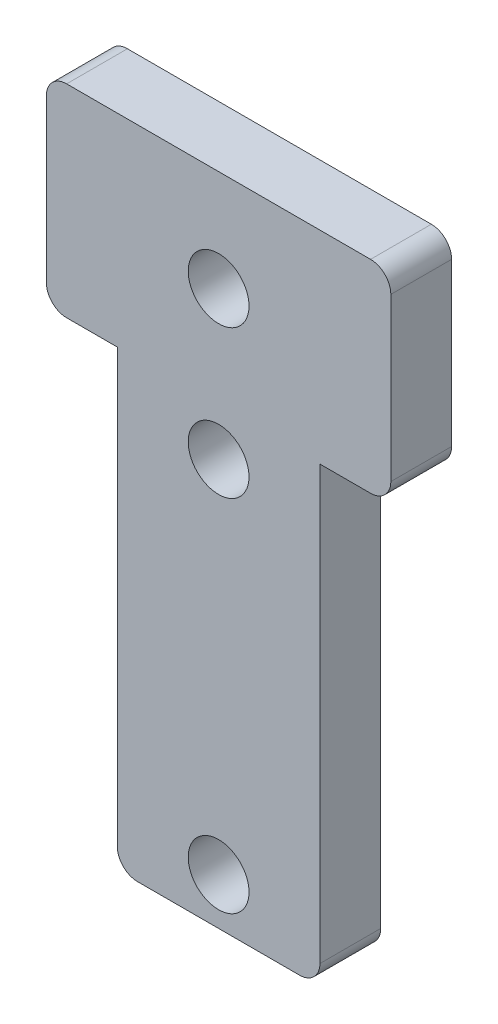
ISO-10303-21;
HEADER;
FILE_DESCRIPTION(('STEP AP214'),'2;1');
FILE_NAME('part.step','',(''),(''),'','','');
FILE_SCHEMA(('AUTOMOTIVE_DESIGN { 1 0 10303 214 1 1 1 1 }'));
ENDSEC;
DATA;
#1=APPLICATION_CONTEXT('core data for automotive mechanical design processes');
#2=APPLICATION_PROTOCOL_DEFINITION('international standard','automotive_design',2000,#1);
#3=PRODUCT_CONTEXT('',#1,'mechanical');
#4=PRODUCT('Part','Part','',(#3));
#5=PRODUCT_RELATED_PRODUCT_CATEGORY('part','',(#4));
#6=PRODUCT_DEFINITION_FORMATION('','',#4);
#7=PRODUCT_DEFINITION_CONTEXT('part definition',#1,'design');
#8=PRODUCT_DEFINITION('design','',#6,#7);
#9=PRODUCT_DEFINITION_SHAPE('','',#8);
#10=(LENGTH_UNIT() NAMED_UNIT(*) SI_UNIT(.MILLI.,.METRE.));
#11=(NAMED_UNIT(*) PLANE_ANGLE_UNIT() SI_UNIT($,.RADIAN.));
#12=(NAMED_UNIT(*) SI_UNIT($,.STERADIAN.) SOLID_ANGLE_UNIT());
#13=UNCERTAINTY_MEASURE_WITH_UNIT(LENGTH_MEASURE(1.E-05),#10,'distance_accuracy_value','');
#14=(GEOMETRIC_REPRESENTATION_CONTEXT(3) GLOBAL_UNCERTAINTY_ASSIGNED_CONTEXT((#13)) GLOBAL_UNIT_ASSIGNED_CONTEXT((#10,
#11,#12)) REPRESENTATION_CONTEXT('',''));
#15=CARTESIAN_POINT('',(0.,0.,0.));
#16=DIRECTION('',(0.,0.,1.));
#17=DIRECTION('',(1.,0.,0.));
#18=AXIS2_PLACEMENT_3D('',#15,#16,#17);
#19=CARTESIAN_POINT('',(0.,5.,3.));
#20=DIRECTION('',(0.,-1.,0.));
#21=DIRECTION('',(1.,0.,0.));
#22=AXIS2_PLACEMENT_3D('',#19,#20,#21);
#23=PLANE('',#22);
#24=DIRECTION('',(-1.,0.,0.));
#25=VECTOR('',#24,1.);
#26=CARTESIAN_POINT('',(0.,5.,0.));
#27=LINE('',#26,#25);
#28=CARTESIAN_POINT('',(7.5,5.,0.));
#29=VERTEX_POINT('',#28);
#30=CARTESIAN_POINT('',(-7.5,5.,0.));
#31=VERTEX_POINT('',#30);
#32=EDGE_CURVE('E200',#29,#31,#27,.T.);
#33=ORIENTED_EDGE('',*,*,#32,.T.);
#34=DIRECTION('',(0.,0.,-1.));
#35=VECTOR('',#34,1.);
#36=CARTESIAN_POINT('',(-7.5,5.,3.));
#37=LINE('',#36,#35);
#38=CARTESIAN_POINT('',(-7.5,5.,3.));
#39=VERTEX_POINT('',#38);
#40=EDGE_CURVE('E64',#31,#39,#37,.F.);
#41=ORIENTED_EDGE('',*,*,#40,.T.);
#42=DIRECTION('',(-1.,0.,0.));
#43=VECTOR('',#42,1.);
#44=CARTESIAN_POINT('',(0.,5.,3.));
#45=LINE('',#44,#43);
#46=CARTESIAN_POINT('',(7.5,5.,3.));
#47=VERTEX_POINT('',#46);
#48=EDGE_CURVE('E176',#47,#39,#45,.T.);
#49=ORIENTED_EDGE('',*,*,#48,.F.);
#50=DIRECTION('',(0.,0.,-1.));
#51=VECTOR('',#50,1.);
#52=CARTESIAN_POINT('',(7.5,5.,0.));
#53=LINE('',#52,#51);
#54=EDGE_CURVE('E265',#47,#29,#53,.T.);
#55=ORIENTED_EDGE('',*,*,#54,.T.);
#56=EDGE_LOOP('',(#33,#41,#49,#55));
#57=FACE_BOUND('',#56,.T.);
#58=ADVANCED_FACE('F43',(#57),#23,.F.);
#59=CARTESIAN_POINT('',(-8.5,0.,3.));
#60=DIRECTION('',(1.,0.,0.));
#61=DIRECTION('',(0.,0.,-1.));
#62=AXIS2_PLACEMENT_3D('',#59,#60,#61);
#63=PLANE('',#62);
#64=DIRECTION('',(0.,-1.,0.));
#65=VECTOR('',#64,1.);
#66=CARTESIAN_POINT('',(-8.5,0.,3.));
#67=LINE('',#66,#65);
#68=CARTESIAN_POINT('',(-8.5,4.,3.));
#69=VERTEX_POINT('',#68);
#70=CARTESIAN_POINT('',(-8.5,-4.,3.));
#71=VERTEX_POINT('',#70);
#72=EDGE_CURVE('E173',#69,#71,#67,.T.);
#73=ORIENTED_EDGE('',*,*,#72,.F.);
#74=DIRECTION('',(0.,0.,-1.));
#75=VECTOR('',#74,1.);
#76=CARTESIAN_POINT('',(-8.5,4.,3.));
#77=LINE('',#76,#75);
#78=CARTESIAN_POINT('',(-8.5,4.,0.));
#79=VERTEX_POINT('',#78);
#80=EDGE_CURVE('E258',#69,#79,#77,.T.);
#81=ORIENTED_EDGE('',*,*,#80,.T.);
#82=DIRECTION('',(0.,-1.,0.));
#83=VECTOR('',#82,1.);
#84=CARTESIAN_POINT('',(-8.5,0.,0.));
#85=LINE('',#84,#83);
#86=CARTESIAN_POINT('',(-8.5,-4.,0.));
#87=VERTEX_POINT('',#86);
#88=EDGE_CURVE('E202',#79,#87,#85,.T.);
#89=ORIENTED_EDGE('',*,*,#88,.T.);
#90=DIRECTION('',(0.,0.,-1.));
#91=VECTOR('',#90,1.);
#92=CARTESIAN_POINT('',(-8.5,-4.,3.));
#93=LINE('',#92,#91);
#94=EDGE_CURVE('E241',#87,#71,#93,.F.);
#95=ORIENTED_EDGE('',*,*,#94,.T.);
#96=EDGE_LOOP('',(#73,#81,#89,#95));
#97=FACE_BOUND('',#96,.T.);
#98=ADVANCED_FACE('F275',(#97),#63,.F.);
#99=CARTESIAN_POINT('',(0.,-5.,3.));
#100=DIRECTION('',(0.,-1.,0.));
#101=DIRECTION('',(1.,0.,0.));
#102=AXIS2_PLACEMENT_3D('',#99,#100,#101);
#103=PLANE('',#102);
#104=DIRECTION('',(-1.,0.,0.));
#105=VECTOR('',#104,1.);
#106=CARTESIAN_POINT('',(0.,-5.,3.));
#107=LINE('',#106,#105);
#108=CARTESIAN_POINT('',(-4.99999999999999,-5.,3.));
#109=VERTEX_POINT('',#108);
#110=CARTESIAN_POINT('',(-7.5,-5.,3.));
#111=VERTEX_POINT('',#110);
#112=EDGE_CURVE('E157',#109,#111,#107,.T.);
#113=ORIENTED_EDGE('',*,*,#112,.T.);
#114=DIRECTION('',(0.,0.,-1.));
#115=VECTOR('',#114,1.);
#116=CARTESIAN_POINT('',(-7.5,-5.,0.));
#117=LINE('',#116,#115);
#118=CARTESIAN_POINT('',(-7.5,-5.,0.));
#119=VERTEX_POINT('',#118);
#120=EDGE_CURVE('E232',#111,#119,#117,.T.);
#121=ORIENTED_EDGE('',*,*,#120,.T.);
#122=DIRECTION('',(-1.,0.,0.));
#123=VECTOR('',#122,1.);
#124=CARTESIAN_POINT('',(0.,-5.,0.));
#125=LINE('',#124,#123);
#126=CARTESIAN_POINT('',(-4.99999999999999,-5.,0.));
#127=VERTEX_POINT('',#126);
#128=EDGE_CURVE('E165',#127,#119,#125,.T.);
#129=ORIENTED_EDGE('',*,*,#128,.F.);
#130=DIRECTION('',(0.,0.,-1.));
#131=VECTOR('',#130,1.);
#132=CARTESIAN_POINT('',(-4.99999999999999,-5.,3.));
#133=LINE('',#132,#131);
#134=EDGE_CURVE('E149',#109,#127,#133,.T.);
#135=ORIENTED_EDGE('',*,*,#134,.F.);
#136=EDGE_LOOP('',(#113,#121,#129,#135));
#137=FACE_BOUND('',#136,.T.);
#138=ADVANCED_FACE('F161',(#137),#103,.T.);
#139=CARTESIAN_POINT('',(-4.99999999999999,0.,3.));
#140=DIRECTION('',(-1.,0.,0.));
#141=DIRECTION('',(0.,0.,1.));
#142=AXIS2_PLACEMENT_3D('',#139,#140,#141);
#143=PLANE('',#142);
#144=DIRECTION('',(0.,1.,0.));
#145=VECTOR('',#144,1.);
#146=CARTESIAN_POINT('',(-4.99999999999999,0.,0.));
#147=LINE('',#146,#145);
#148=CARTESIAN_POINT('',(-4.99999999999999,-26.35,0.));
#149=VERTEX_POINT('',#148);
#150=EDGE_CURVE('E205',#149,#127,#147,.T.);
#151=ORIENTED_EDGE('',*,*,#150,.F.);
#152=DIRECTION('',(0.,0.,-1.));
#153=VECTOR('',#152,1.);
#154=CARTESIAN_POINT('',(-4.99999999999999,-26.35,3.));
#155=LINE('',#154,#153);
#156=CARTESIAN_POINT('',(-4.99999999999999,-26.35,3.));
#157=VERTEX_POINT('',#156);
#158=EDGE_CURVE('E152',#149,#157,#155,.F.);
#159=ORIENTED_EDGE('',*,*,#158,.T.);
#160=DIRECTION('',(0.,1.,0.));
#161=VECTOR('',#160,1.);
#162=CARTESIAN_POINT('',(-4.99999999999999,0.,3.));
#163=LINE('',#162,#161);
#164=EDGE_CURVE('E145',#157,#109,#163,.T.);
#165=ORIENTED_EDGE('',*,*,#164,.T.);
#166=ORIENTED_EDGE('',*,*,#134,.T.);
#167=EDGE_LOOP('',(#151,#159,#165,#166));
#168=FACE_BOUND('',#167,.T.);
#169=ADVANCED_FACE('F148',(#168),#143,.T.);
#170=CARTESIAN_POINT('',(0.,-27.35,3.));
#171=DIRECTION('',(0.,1.,0.));
#172=DIRECTION('',(0.,0.,1.));
#173=AXIS2_PLACEMENT_3D('',#170,#171,#172);
#174=PLANE('',#173);
#175=DIRECTION('',(1.,0.,0.));
#176=VECTOR('',#175,1.);
#177=CARTESIAN_POINT('',(0.,-27.35,3.));
#178=LINE('',#177,#176);
#179=CARTESIAN_POINT('',(-3.99999999999999,-27.35,3.));
#180=VERTEX_POINT('',#179);
#181=CARTESIAN_POINT('',(4.00000000000001,-27.35,3.));
#182=VERTEX_POINT('',#181);
#183=EDGE_CURVE('E156',#180,#182,#178,.T.);
#184=ORIENTED_EDGE('',*,*,#183,.F.);
#185=DIRECTION('',(0.,0.,-1.));
#186=VECTOR('',#185,1.);
#187=CARTESIAN_POINT('',(-3.99999999999999,-27.35,0.));
#188=LINE('',#187,#186);
#189=CARTESIAN_POINT('',(-3.99999999999999,-27.35,0.));
#190=VERTEX_POINT('',#189);
#191=EDGE_CURVE('E251',#180,#190,#188,.T.);
#192=ORIENTED_EDGE('',*,*,#191,.T.);
#193=DIRECTION('',(1.,0.,0.));
#194=VECTOR('',#193,1.);
#195=CARTESIAN_POINT('',(0.,-27.35,0.));
#196=LINE('',#195,#194);
#197=CARTESIAN_POINT('',(4.00000000000001,-27.35,0.));
#198=VERTEX_POINT('',#197);
#199=EDGE_CURVE('E208',#190,#198,#196,.T.);
#200=ORIENTED_EDGE('',*,*,#199,.T.);
#201=DIRECTION('',(0.,0.,-1.));
#202=VECTOR('',#201,1.);
#203=CARTESIAN_POINT('',(4.00000000000001,-27.35,3.));
#204=LINE('',#203,#202);
#205=EDGE_CURVE('E249',#198,#182,#204,.F.);
#206=ORIENTED_EDGE('',*,*,#205,.T.);
#207=EDGE_LOOP('',(#184,#192,#200,#206));
#208=FACE_BOUND('',#207,.T.);
#209=ADVANCED_FACE('F305',(#208),#174,.F.);
#210=CARTESIAN_POINT('',(5.00000000000001,0.,3.));
#211=DIRECTION('',(-1.,0.,0.));
#212=DIRECTION('',(0.,0.,1.));
#213=AXIS2_PLACEMENT_3D('',#210,#211,#212);
#214=PLANE('',#213);
#215=DIRECTION('',(0.,1.,0.));
#216=VECTOR('',#215,1.);
#217=CARTESIAN_POINT('',(5.00000000000001,0.,3.));
#218=LINE('',#217,#216);
#219=CARTESIAN_POINT('',(5.00000000000001,-26.35,3.));
#220=VERTEX_POINT('',#219);
#221=CARTESIAN_POINT('',(5.00000000000001,-5.,3.));
#222=VERTEX_POINT('',#221);
#223=EDGE_CURVE('E180',#220,#222,#218,.T.);
#224=ORIENTED_EDGE('',*,*,#223,.F.);
#225=DIRECTION('',(0.,0.,-1.));
#226=VECTOR('',#225,1.);
#227=CARTESIAN_POINT('',(5.00000000000001,-26.35,3.));
#228=LINE('',#227,#226);
#229=CARTESIAN_POINT('',(5.00000000000001,-26.35,0.));
#230=VERTEX_POINT('',#229);
#231=EDGE_CURVE('E255',#220,#230,#228,.T.);
#232=ORIENTED_EDGE('',*,*,#231,.T.);
#233=DIRECTION('',(0.,1.,0.));
#234=VECTOR('',#233,1.);
#235=CARTESIAN_POINT('',(5.00000000000001,0.,0.));
#236=LINE('',#235,#234);
#237=CARTESIAN_POINT('',(5.00000000000001,-5.,0.));
#238=VERTEX_POINT('',#237);
#239=EDGE_CURVE('E211',#230,#238,#236,.T.);
#240=ORIENTED_EDGE('',*,*,#239,.T.);
#241=DIRECTION('',(0.,0.,-1.));
#242=VECTOR('',#241,1.);
#243=CARTESIAN_POINT('',(5.00000000000001,-5.,3.));
#244=LINE('',#243,#242);
#245=EDGE_CURVE('E167',#222,#238,#244,.T.);
#246=ORIENTED_EDGE('',*,*,#245,.F.);
#247=EDGE_LOOP('',(#224,#232,#240,#246));
#248=FACE_BOUND('',#247,.T.);
#249=ADVANCED_FACE('F298',(#248),#214,.F.);
#250=CARTESIAN_POINT('',(7.5,-5.,0.));
#251=VERTEX_POINT('',#250);
#252=EDGE_CURVE('E206',#251,#238,#125,.T.);
#253=ORIENTED_EDGE('',*,*,#252,.F.);
#254=DIRECTION('',(0.,0.,-1.));
#255=VECTOR('',#254,1.);
#256=CARTESIAN_POINT('',(7.5,-5.,3.));
#257=LINE('',#256,#255);
#258=CARTESIAN_POINT('',(7.5,-5.,3.));
#259=VERTEX_POINT('',#258);
#260=EDGE_CURVE('E227',#251,#259,#257,.F.);
#261=ORIENTED_EDGE('',*,*,#260,.T.);
#262=EDGE_CURVE('E175',#259,#222,#107,.T.);
#263=ORIENTED_EDGE('',*,*,#262,.T.);
#264=ORIENTED_EDGE('',*,*,#245,.T.);
#265=EDGE_LOOP('',(#253,#261,#263,#264));
#266=FACE_BOUND('',#265,.T.);
#267=ADVANCED_FACE('F296',(#266),#103,.T.);
#268=CARTESIAN_POINT('',(0.,-25.05,3.));
#269=DIRECTION('',(0.,0.,-1.));
#270=DIRECTION('',(-1.,0.,0.));
#271=AXIS2_PLACEMENT_3D('',#268,#269,#270);
#272=CYLINDRICAL_SURFACE('',#271,1.5);
#273=CARTESIAN_POINT('',(0.,-25.05,3.));
#274=DIRECTION('',(0.,0.,1.));
#275=DIRECTION('',(1.,0.,0.));
#276=AXIS2_PLACEMENT_3D('',#273,#274,#275);
#277=CIRCLE('',#276,1.5);
#278=CARTESIAN_POINT('',(1.5,-25.05,3.));
#279=VERTEX_POINT('',#278);
#280=EDGE_CURVE('E185',#279,#279,#277,.T.);
#281=ORIENTED_EDGE('',*,*,#280,.T.);
#282=EDGE_LOOP('',(#281));
#283=FACE_BOUND('',#282,.T.);
#284=CARTESIAN_POINT('',(0.,-25.05,0.));
#285=DIRECTION('',(0.,0.,1.));
#286=DIRECTION('',(1.,0.,0.));
#287=AXIS2_PLACEMENT_3D('',#284,#285,#286);
#288=CIRCLE('',#287,1.5);
#289=CARTESIAN_POINT('',(1.5,-25.05,0.));
#290=VERTEX_POINT('',#289);
#291=EDGE_CURVE('E215',#290,#290,#288,.T.);
#292=ORIENTED_EDGE('',*,*,#291,.F.);
#293=EDGE_LOOP('',(#292));
#294=FACE_BOUND('',#293,.T.);
#295=ADVANCED_FACE('F342',(#283,#294),#272,.F.);
#296=CARTESIAN_POINT('',(8.5,0.,3.));
#297=DIRECTION('',(1.,0.,0.));
#298=DIRECTION('',(0.,1.,0.));
#299=AXIS2_PLACEMENT_3D('',#296,#297,#298);
#300=PLANE('',#299);
#301=DIRECTION('',(0.,-1.,0.));
#302=VECTOR('',#301,1.);
#303=CARTESIAN_POINT('',(8.5,0.,0.));
#304=LINE('',#303,#302);
#305=CARTESIAN_POINT('',(8.5,4.,0.));
#306=VERTEX_POINT('',#305);
#307=CARTESIAN_POINT('',(8.5,-4.,0.));
#308=VERTEX_POINT('',#307);
#309=EDGE_CURVE('E213',#306,#308,#304,.T.);
#310=ORIENTED_EDGE('',*,*,#309,.F.);
#311=DIRECTION('',(0.,0.,-1.));
#312=VECTOR('',#311,1.);
#313=CARTESIAN_POINT('',(8.5,4.,3.));
#314=LINE('',#313,#312);
#315=CARTESIAN_POINT('',(8.5,4.,3.));
#316=VERTEX_POINT('',#315);
#317=EDGE_CURVE('E11',#306,#316,#314,.F.);
#318=ORIENTED_EDGE('',*,*,#317,.T.);
#319=DIRECTION('',(0.,-1.,0.));
#320=VECTOR('',#319,1.);
#321=CARTESIAN_POINT('',(8.5,0.,3.));
#322=LINE('',#321,#320);
#323=CARTESIAN_POINT('',(8.5,-4.,3.));
#324=VERTEX_POINT('',#323);
#325=EDGE_CURVE('E179',#316,#324,#322,.T.);
#326=ORIENTED_EDGE('',*,*,#325,.T.);
#327=DIRECTION('',(0.,0.,-1.));
#328=VECTOR('',#327,1.);
#329=CARTESIAN_POINT('',(8.5,-4.,3.));
#330=LINE('',#329,#328);
#331=EDGE_CURVE('E166',#324,#308,#330,.T.);
#332=ORIENTED_EDGE('',*,*,#331,.T.);
#333=EDGE_LOOP('',(#310,#318,#326,#332));
#334=FACE_BOUND('',#333,.T.);
#335=ADVANCED_FACE('F287',(#334),#300,.T.);
#336=CARTESIAN_POINT('',(0.,0.,3.));
#337=DIRECTION('',(0.,0.,-1.));
#338=DIRECTION('',(-1.,0.,0.));
#339=AXIS2_PLACEMENT_3D('',#336,#337,#338);
#340=CYLINDRICAL_SURFACE('',#339,1.5);
#341=CARTESIAN_POINT('',(0.,0.,3.));
#342=DIRECTION('',(0.,0.,1.));
#343=DIRECTION('',(1.,0.,0.));
#344=AXIS2_PLACEMENT_3D('',#341,#342,#343);
#345=CIRCLE('',#344,1.5);
#346=CARTESIAN_POINT('',(1.50000000000001,0.,3.));
#347=VERTEX_POINT('',#346);
#348=EDGE_CURVE('E221',#347,#347,#345,.T.);
#349=ORIENTED_EDGE('',*,*,#348,.T.);
#350=EDGE_LOOP('',(#349));
#351=FACE_BOUND('',#350,.T.);
#352=CARTESIAN_POINT('',(0.,0.,0.));
#353=DIRECTION('',(0.,0.,1.));
#354=DIRECTION('',(1.,0.,0.));
#355=AXIS2_PLACEMENT_3D('',#352,#353,#354);
#356=CIRCLE('',#355,1.5);
#357=CARTESIAN_POINT('',(1.50000000000001,0.,0.));
#358=VERTEX_POINT('',#357);
#359=EDGE_CURVE('E197',#358,#358,#356,.T.);
#360=ORIENTED_EDGE('',*,*,#359,.F.);
#361=EDGE_LOOP('',(#360));
#362=FACE_BOUND('',#361,.T.);
#363=ADVANCED_FACE('F331',(#351,#362),#340,.F.);
#364=CARTESIAN_POINT('',(0.,-7.3,3.));
#365=DIRECTION('',(0.,0.,-1.));
#366=DIRECTION('',(-1.,0.,0.));
#367=AXIS2_PLACEMENT_3D('',#364,#365,#366);
#368=CYLINDRICAL_SURFACE('',#367,1.5);
#369=CARTESIAN_POINT('',(0.,-7.3,3.));
#370=DIRECTION('',(0.,0.,1.));
#371=DIRECTION('',(1.,0.,0.));
#372=AXIS2_PLACEMENT_3D('',#369,#370,#371);
#373=CIRCLE('',#372,1.5);
#374=CARTESIAN_POINT('',(1.5,-7.3,3.));
#375=VERTEX_POINT('',#374);
#376=EDGE_CURVE('E194',#375,#375,#373,.T.);
#377=ORIENTED_EDGE('',*,*,#376,.T.);
#378=EDGE_LOOP('',(#377));
#379=FACE_BOUND('',#378,.T.);
#380=CARTESIAN_POINT('',(0.,-7.3,0.));
#381=DIRECTION('',(0.,0.,1.));
#382=DIRECTION('',(1.,0.,0.));
#383=AXIS2_PLACEMENT_3D('',#380,#381,#382);
#384=CIRCLE('',#383,1.5);
#385=CARTESIAN_POINT('',(1.5,-7.3,0.));
#386=VERTEX_POINT('',#385);
#387=EDGE_CURVE('E218',#386,#386,#384,.T.);
#388=ORIENTED_EDGE('',*,*,#387,.F.);
#389=EDGE_LOOP('',(#388));
#390=FACE_BOUND('',#389,.T.);
#391=ADVANCED_FACE('F333',(#379,#390),#368,.F.);
#392=CARTESIAN_POINT('',(0.,0.,3.));
#393=DIRECTION('',(0.,0.,1.));
#394=DIRECTION('',(1.,0.,0.));
#395=AXIS2_PLACEMENT_3D('',#392,#393,#394);
#396=PLANE('',#395);
#397=ORIENTED_EDGE('',*,*,#348,.F.);
#398=EDGE_LOOP('',(#397));
#399=FACE_BOUND('',#398,.T.);
#400=ORIENTED_EDGE('',*,*,#48,.T.);
#401=CARTESIAN_POINT('',(-7.5,4.,3.));
#402=DIRECTION('',(0.,0.,1.));
#403=DIRECTION('',(1.,0.,0.));
#404=AXIS2_PLACEMENT_3D('',#401,#402,#403);
#405=CIRCLE('',#404,1.);
#406=EDGE_CURVE('E51',#39,#69,#405,.T.);
#407=ORIENTED_EDGE('',*,*,#406,.T.);
#408=ORIENTED_EDGE('',*,*,#72,.T.);
#409=CARTESIAN_POINT('',(-7.5,-4.,3.));
#410=DIRECTION('',(0.,0.,1.));
#411=DIRECTION('',(1.,0.,0.));
#412=AXIS2_PLACEMENT_3D('',#409,#410,#411);
#413=CIRCLE('',#412,1.);
#414=EDGE_CURVE('E172',#71,#111,#413,.T.);
#415=ORIENTED_EDGE('',*,*,#414,.T.);
#416=ORIENTED_EDGE('',*,*,#112,.F.);
#417=ORIENTED_EDGE('',*,*,#164,.F.);
#418=CARTESIAN_POINT('',(-3.99999999999999,-26.35,3.));
#419=DIRECTION('',(0.,0.,1.));
#420=DIRECTION('',(1.,0.,0.));
#421=AXIS2_PLACEMENT_3D('',#418,#419,#420);
#422=CIRCLE('',#421,1.);
#423=EDGE_CURVE('E246',#157,#180,#422,.T.);
#424=ORIENTED_EDGE('',*,*,#423,.T.);
#425=ORIENTED_EDGE('',*,*,#183,.T.);
#426=CARTESIAN_POINT('',(4.00000000000001,-26.35,3.));
#427=DIRECTION('',(0.,0.,1.));
#428=DIRECTION('',(1.,0.,0.));
#429=AXIS2_PLACEMENT_3D('',#426,#427,#428);
#430=CIRCLE('',#429,1.);
#431=EDGE_CURVE('E244',#182,#220,#430,.T.);
#432=ORIENTED_EDGE('',*,*,#431,.T.);
#433=ORIENTED_EDGE('',*,*,#223,.T.);
#434=ORIENTED_EDGE('',*,*,#262,.F.);
#435=CARTESIAN_POINT('',(7.5,-4.,3.));
#436=DIRECTION('',(0.,0.,1.));
#437=DIRECTION('',(1.,0.,0.));
#438=AXIS2_PLACEMENT_3D('',#435,#436,#437);
#439=CIRCLE('',#438,1.);
#440=EDGE_CURVE('E229',#259,#324,#439,.T.);
#441=ORIENTED_EDGE('',*,*,#440,.T.);
#442=ORIENTED_EDGE('',*,*,#325,.F.);
#443=CARTESIAN_POINT('',(7.5,4.,3.));
#444=DIRECTION('',(0.,0.,1.));
#445=DIRECTION('',(1.,0.,0.));
#446=AXIS2_PLACEMENT_3D('',#443,#444,#445);
#447=CIRCLE('',#446,1.);
#448=EDGE_CURVE('E269',#316,#47,#447,.T.);
#449=ORIENTED_EDGE('',*,*,#448,.T.);
#450=EDGE_LOOP('',(#400,#407,#408,#415,#416,#417,#424,#425,#432,#433,#434,#441,#442,#449));
#451=FACE_BOUND('',#450,.T.);
#452=ORIENTED_EDGE('',*,*,#280,.F.);
#453=EDGE_LOOP('',(#452));
#454=FACE_BOUND('',#453,.T.);
#455=ORIENTED_EDGE('',*,*,#376,.F.);
#456=EDGE_LOOP('',(#455));
#457=FACE_BOUND('',#456,.T.);
#458=ADVANCED_FACE('F169',(#399,#451,#454,#457),#396,.T.);
#459=CARTESIAN_POINT('',(0.,0.,0.));
#460=DIRECTION('',(0.,0.,1.));
#461=DIRECTION('',(1.,0.,0.));
#462=AXIS2_PLACEMENT_3D('',#459,#460,#461);
#463=PLANE('',#462);
#464=ORIENTED_EDGE('',*,*,#359,.T.);
#465=EDGE_LOOP('',(#464));
#466=FACE_BOUND('',#465,.T.);
#467=ORIENTED_EDGE('',*,*,#88,.F.);
#468=CARTESIAN_POINT('',(-7.5,4.,0.));
#469=DIRECTION('',(0.,0.,1.));
#470=DIRECTION('',(1.,0.,0.));
#471=AXIS2_PLACEMENT_3D('',#468,#469,#470);
#472=CIRCLE('',#471,1.);
#473=EDGE_CURVE('E263',#79,#31,#472,.F.);
#474=ORIENTED_EDGE('',*,*,#473,.T.);
#475=ORIENTED_EDGE('',*,*,#32,.F.);
#476=CARTESIAN_POINT('',(7.5,4.,0.));
#477=DIRECTION('',(0.,0.,1.));
#478=DIRECTION('',(1.,0.,0.));
#479=AXIS2_PLACEMENT_3D('',#476,#477,#478);
#480=CIRCLE('',#479,1.);
#481=EDGE_CURVE('E261',#29,#306,#480,.F.);
#482=ORIENTED_EDGE('',*,*,#481,.T.);
#483=ORIENTED_EDGE('',*,*,#309,.T.);
#484=CARTESIAN_POINT('',(7.5,-4.,0.));
#485=DIRECTION('',(0.,0.,1.));
#486=DIRECTION('',(1.,0.,0.));
#487=AXIS2_PLACEMENT_3D('',#484,#485,#486);
#488=CIRCLE('',#487,1.);
#489=EDGE_CURVE('E225',#308,#251,#488,.F.);
#490=ORIENTED_EDGE('',*,*,#489,.T.);
#491=ORIENTED_EDGE('',*,*,#252,.T.);
#492=ORIENTED_EDGE('',*,*,#239,.F.);
#493=CARTESIAN_POINT('',(4.00000000000001,-26.35,0.));
#494=DIRECTION('',(0.,0.,1.));
#495=DIRECTION('',(1.,0.,0.));
#496=AXIS2_PLACEMENT_3D('',#493,#494,#495);
#497=CIRCLE('',#496,1.);
#498=EDGE_CURVE('E234',#230,#198,#497,.F.);
#499=ORIENTED_EDGE('',*,*,#498,.T.);
#500=ORIENTED_EDGE('',*,*,#199,.F.);
#501=CARTESIAN_POINT('',(-3.99999999999999,-26.35,0.));
#502=DIRECTION('',(0.,0.,1.));
#503=DIRECTION('',(1.,0.,0.));
#504=AXIS2_PLACEMENT_3D('',#501,#502,#503);
#505=CIRCLE('',#504,1.);
#506=EDGE_CURVE('E236',#190,#149,#505,.F.);
#507=ORIENTED_EDGE('',*,*,#506,.T.);
#508=ORIENTED_EDGE('',*,*,#150,.T.);
#509=ORIENTED_EDGE('',*,*,#128,.T.);
#510=CARTESIAN_POINT('',(-7.5,-4.,0.));
#511=DIRECTION('',(0.,0.,1.));
#512=DIRECTION('',(1.,0.,0.));
#513=AXIS2_PLACEMENT_3D('',#510,#511,#512);
#514=CIRCLE('',#513,1.);
#515=EDGE_CURVE('E238',#119,#87,#514,.F.);
#516=ORIENTED_EDGE('',*,*,#515,.T.);
#517=EDGE_LOOP('',(#467,#474,#475,#482,#483,#490,#491,#492,#499,#500,#507,#508,#509,#516));
#518=FACE_BOUND('',#517,.T.);
#519=ORIENTED_EDGE('',*,*,#291,.T.);
#520=EDGE_LOOP('',(#519));
#521=FACE_BOUND('',#520,.T.);
#522=ORIENTED_EDGE('',*,*,#387,.T.);
#523=EDGE_LOOP('',(#522));
#524=FACE_BOUND('',#523,.T.);
#525=ADVANCED_FACE('F281',(#466,#518,#521,#524),#463,.F.);
#526=CARTESIAN_POINT('',(7.5,-4.,3.));
#527=DIRECTION('',(0.,0.,-1.));
#528=DIRECTION('',(-1.,0.,0.));
#529=AXIS2_PLACEMENT_3D('',#526,#527,#528);
#530=CYLINDRICAL_SURFACE('',#529,1.);
#531=ORIENTED_EDGE('',*,*,#440,.F.);
#532=ORIENTED_EDGE('',*,*,#260,.F.);
#533=ORIENTED_EDGE('',*,*,#489,.F.);
#534=ORIENTED_EDGE('',*,*,#331,.F.);
#535=EDGE_LOOP('',(#531,#532,#533,#534));
#536=FACE_BOUND('',#535,.T.);
#537=ADVANCED_FACE('F291',(#536),#530,.T.);
#538=CARTESIAN_POINT('',(-7.5,-4.,3.));
#539=DIRECTION('',(0.,0.,1.));
#540=DIRECTION('',(1.,0.,0.));
#541=AXIS2_PLACEMENT_3D('',#538,#539,#540);
#542=CYLINDRICAL_SURFACE('',#541,1.);
#543=ORIENTED_EDGE('',*,*,#414,.F.);
#544=ORIENTED_EDGE('',*,*,#94,.F.);
#545=ORIENTED_EDGE('',*,*,#515,.F.);
#546=ORIENTED_EDGE('',*,*,#120,.F.);
#547=EDGE_LOOP('',(#543,#544,#545,#546));
#548=FACE_BOUND('',#547,.T.);
#549=ADVANCED_FACE('F312',(#548),#542,.T.);
#550=CARTESIAN_POINT('',(-3.99999999999999,-26.35,3.));
#551=DIRECTION('',(0.,0.,1.));
#552=DIRECTION('',(1.,0.,0.));
#553=AXIS2_PLACEMENT_3D('',#550,#551,#552);
#554=CYLINDRICAL_SURFACE('',#553,1.);
#555=ORIENTED_EDGE('',*,*,#423,.F.);
#556=ORIENTED_EDGE('',*,*,#158,.F.);
#557=ORIENTED_EDGE('',*,*,#506,.F.);
#558=ORIENTED_EDGE('',*,*,#191,.F.);
#559=EDGE_LOOP('',(#555,#556,#557,#558));
#560=FACE_BOUND('',#559,.T.);
#561=ADVANCED_FACE('F310',(#560),#554,.T.);
#562=CARTESIAN_POINT('',(4.00000000000001,-26.35,3.));
#563=DIRECTION('',(0.,0.,-1.));
#564=DIRECTION('',(-1.,0.,0.));
#565=AXIS2_PLACEMENT_3D('',#562,#563,#564);
#566=CYLINDRICAL_SURFACE('',#565,1.);
#567=ORIENTED_EDGE('',*,*,#431,.F.);
#568=ORIENTED_EDGE('',*,*,#205,.F.);
#569=ORIENTED_EDGE('',*,*,#498,.F.);
#570=ORIENTED_EDGE('',*,*,#231,.F.);
#571=EDGE_LOOP('',(#567,#568,#569,#570));
#572=FACE_BOUND('',#571,.T.);
#573=ADVANCED_FACE('F308',(#572),#566,.T.);
#574=CARTESIAN_POINT('',(-7.5,4.,3.));
#575=DIRECTION('',(0.,0.,-1.));
#576=DIRECTION('',(-1.,0.,0.));
#577=AXIS2_PLACEMENT_3D('',#574,#575,#576);
#578=CYLINDRICAL_SURFACE('',#577,1.);
#579=ORIENTED_EDGE('',*,*,#406,.F.);
#580=ORIENTED_EDGE('',*,*,#40,.F.);
#581=ORIENTED_EDGE('',*,*,#473,.F.);
#582=ORIENTED_EDGE('',*,*,#80,.F.);
#583=EDGE_LOOP('',(#579,#580,#581,#582));
#584=FACE_BOUND('',#583,.T.);
#585=ADVANCED_FACE('F278',(#584),#578,.T.);
#586=CARTESIAN_POINT('',(7.5,4.,3.));
#587=DIRECTION('',(0.,0.,1.));
#588=DIRECTION('',(1.,0.,0.));
#589=AXIS2_PLACEMENT_3D('',#586,#587,#588);
#590=CYLINDRICAL_SURFACE('',#589,1.);
#591=ORIENTED_EDGE('',*,*,#448,.F.);
#592=ORIENTED_EDGE('',*,*,#317,.F.);
#593=ORIENTED_EDGE('',*,*,#481,.F.);
#594=ORIENTED_EDGE('',*,*,#54,.F.);
#595=EDGE_LOOP('',(#591,#592,#593,#594));
#596=FACE_BOUND('',#595,.T.);
#597=ADVANCED_FACE('F45',(#596),#590,.T.);
#598=CLOSED_SHELL('',(#58,#98,#138,#169,#209,#249,#267,#295,#335,#363,#391,#458,#525,#537,#549,
#561,#573,#585,#597));
#599=MANIFOLD_SOLID_BREP('B2',#598);
#600=ADVANCED_BREP_SHAPE_REPRESENTATION('',(#18,#599),#14);
#601=SHAPE_DEFINITION_REPRESENTATION(#9,#600);
ENDSEC;
END-ISO-10303-21;
